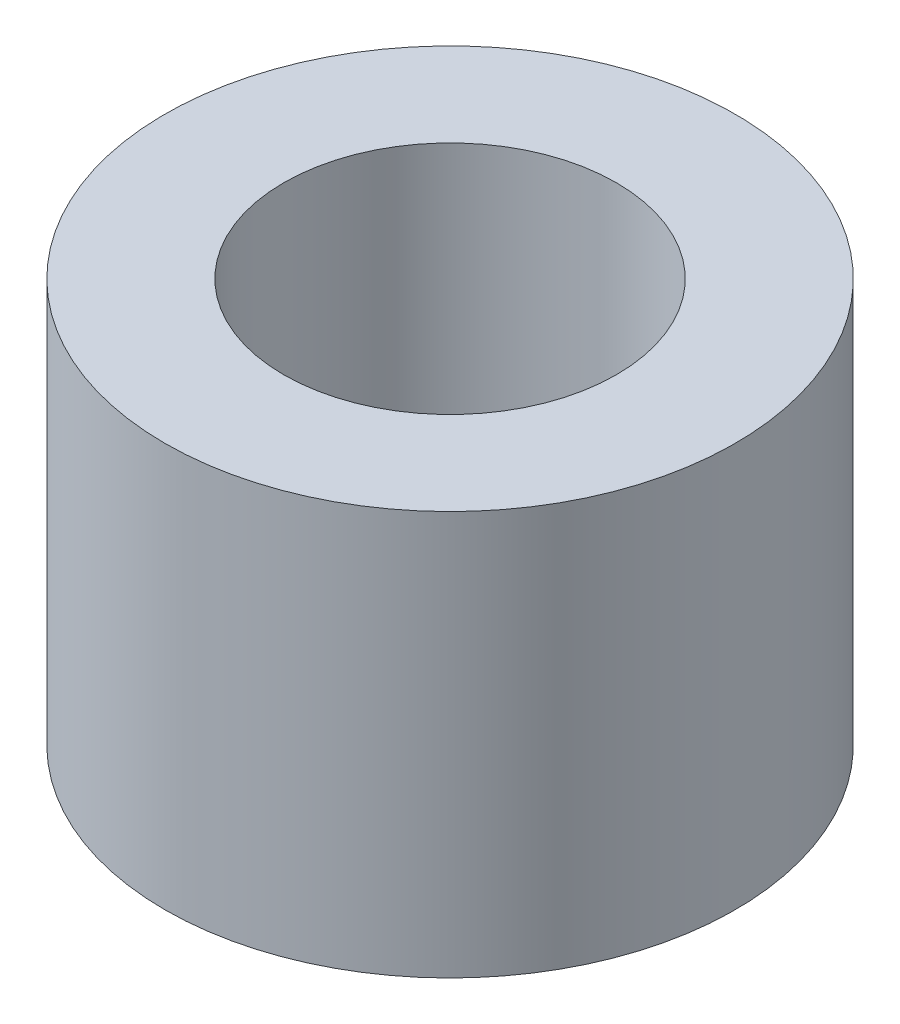
ISO-10303-21;
HEADER;
FILE_DESCRIPTION(('STEP AP214'),'2;1');
FILE_NAME('part.step','',(''),(''),'','','');
FILE_SCHEMA(('AUTOMOTIVE_DESIGN { 1 0 10303 214 1 1 1 1 }'));
ENDSEC;
DATA;
#1=APPLICATION_CONTEXT('core data for automotive mechanical design processes');
#2=APPLICATION_PROTOCOL_DEFINITION('international standard','automotive_design',2000,#1);
#3=PRODUCT_CONTEXT('',#1,'mechanical');
#4=PRODUCT('Part','Part','',(#3));
#5=PRODUCT_RELATED_PRODUCT_CATEGORY('part','',(#4));
#6=PRODUCT_DEFINITION_FORMATION('','',#4);
#7=PRODUCT_DEFINITION_CONTEXT('part definition',#1,'design');
#8=PRODUCT_DEFINITION('design','',#6,#7);
#9=PRODUCT_DEFINITION_SHAPE('','',#8);
#10=(LENGTH_UNIT() NAMED_UNIT(*) SI_UNIT(.MILLI.,.METRE.));
#11=(NAMED_UNIT(*) PLANE_ANGLE_UNIT() SI_UNIT($,.RADIAN.));
#12=(NAMED_UNIT(*) SI_UNIT($,.STERADIAN.) SOLID_ANGLE_UNIT());
#13=UNCERTAINTY_MEASURE_WITH_UNIT(LENGTH_MEASURE(1.E-05),#10,'distance_accuracy_value','');
#14=(GEOMETRIC_REPRESENTATION_CONTEXT(3) GLOBAL_UNCERTAINTY_ASSIGNED_CONTEXT((#13)) GLOBAL_UNIT_ASSIGNED_CONTEXT((#10,
#11,#12)) REPRESENTATION_CONTEXT('',''));
#15=CARTESIAN_POINT('',(0.,0.,0.));
#16=DIRECTION('',(0.,0.,1.));
#17=DIRECTION('',(1.,0.,0.));
#18=AXIS2_PLACEMENT_3D('',#15,#16,#17);
#19=CARTESIAN_POINT('',(0.,8.5,0.));
#20=DIRECTION('',(0.,1.,0.));
#21=DIRECTION('',(0.,0.,1.));
#22=AXIS2_PLACEMENT_3D('',#19,#20,#21);
#23=PLANE('',#22);
#24=CARTESIAN_POINT('',(0.,8.5,0.));
#25=DIRECTION('',(0.,1.,0.));
#26=DIRECTION('',(0.,0.,1.));
#27=AXIS2_PLACEMENT_3D('',#24,#25,#26);
#28=CIRCLE('',#27,6.);
#29=CARTESIAN_POINT('',(0.,8.5,6.));
#30=VERTEX_POINT('',#29);
#31=EDGE_CURVE('E10',#30,#30,#28,.T.);
#32=ORIENTED_EDGE('',*,*,#31,.T.);
#33=EDGE_LOOP('',(#32));
#34=FACE_BOUND('',#33,.T.);
#35=CARTESIAN_POINT('',(0.,8.5,0.));
#36=DIRECTION('',(0.,1.,0.));
#37=DIRECTION('',(0.,0.,1.));
#38=AXIS2_PLACEMENT_3D('',#35,#36,#37);
#39=CIRCLE('',#38,3.5);
#40=CARTESIAN_POINT('',(0.,8.5,3.5));
#41=VERTEX_POINT('',#40);
#42=EDGE_CURVE('E42',#41,#41,#39,.T.);
#43=ORIENTED_EDGE('',*,*,#42,.F.);
#44=EDGE_LOOP('',(#43));
#45=FACE_BOUND('',#44,.T.);
#46=ADVANCED_FACE('F31',(#34,#45),#23,.T.);
#47=CARTESIAN_POINT('',(0.,0.,0.));
#48=DIRECTION('',(0.,1.,0.));
#49=DIRECTION('',(0.,0.,1.));
#50=AXIS2_PLACEMENT_3D('',#47,#48,#49);
#51=PLANE('',#50);
#52=CARTESIAN_POINT('',(0.,0.,0.));
#53=DIRECTION('',(0.,1.,0.));
#54=DIRECTION('',(0.,0.,1.));
#55=AXIS2_PLACEMENT_3D('',#52,#53,#54);
#56=CIRCLE('',#55,6.);
#57=CARTESIAN_POINT('',(0.,0.,6.));
#58=VERTEX_POINT('',#57);
#59=EDGE_CURVE('E35',#58,#58,#56,.T.);
#60=ORIENTED_EDGE('',*,*,#59,.F.);
#61=EDGE_LOOP('',(#60));
#62=FACE_BOUND('',#61,.T.);
#63=CARTESIAN_POINT('',(0.,0.,0.));
#64=DIRECTION('',(0.,1.,0.));
#65=DIRECTION('',(0.,0.,1.));
#66=AXIS2_PLACEMENT_3D('',#63,#64,#65);
#67=CIRCLE('',#66,3.5);
#68=CARTESIAN_POINT('',(0.,0.,3.5));
#69=VERTEX_POINT('',#68);
#70=EDGE_CURVE('E44',#69,#69,#67,.T.);
#71=ORIENTED_EDGE('',*,*,#70,.T.);
#72=EDGE_LOOP('',(#71));
#73=FACE_BOUND('',#72,.T.);
#74=ADVANCED_FACE('F54',(#62,#73),#51,.F.);
#75=CARTESIAN_POINT('',(0.,8.5,0.));
#76=DIRECTION('',(0.,-1.,0.));
#77=DIRECTION('',(0.,0.,-1.));
#78=AXIS2_PLACEMENT_3D('',#75,#76,#77);
#79=CYLINDRICAL_SURFACE('',#78,6.);
#80=ORIENTED_EDGE('',*,*,#31,.F.);
#81=EDGE_LOOP('',(#80));
#82=FACE_BOUND('',#81,.T.);
#83=ORIENTED_EDGE('',*,*,#59,.T.);
#84=EDGE_LOOP('',(#83));
#85=FACE_BOUND('',#84,.T.);
#86=ADVANCED_FACE('F33',(#82,#85),#79,.T.);
#87=CARTESIAN_POINT('',(0.,8.5,0.));
#88=DIRECTION('',(0.,-1.,0.));
#89=DIRECTION('',(0.,0.,-1.));
#90=AXIS2_PLACEMENT_3D('',#87,#88,#89);
#91=CYLINDRICAL_SURFACE('',#90,3.5);
#92=ORIENTED_EDGE('',*,*,#42,.T.);
#93=EDGE_LOOP('',(#92));
#94=FACE_BOUND('',#93,.T.);
#95=ORIENTED_EDGE('',*,*,#70,.F.);
#96=EDGE_LOOP('',(#95));
#97=FACE_BOUND('',#96,.T.);
#98=ADVANCED_FACE('F50',(#94,#97),#91,.F.);
#99=CLOSED_SHELL('',(#46,#74,#86,#98));
#100=MANIFOLD_SOLID_BREP('B2',#99);
#101=ADVANCED_BREP_SHAPE_REPRESENTATION('',(#18,#100),#14);
#102=SHAPE_DEFINITION_REPRESENTATION(#9,#101);
ENDSEC;
END-ISO-10303-21;
